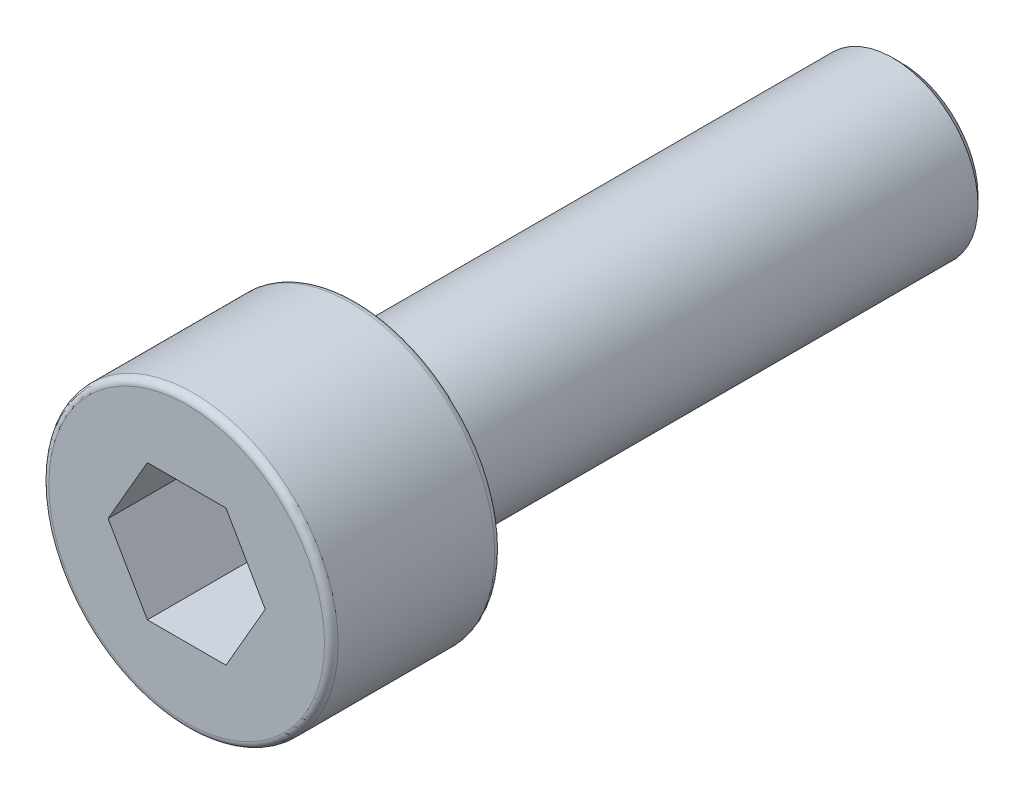
ISO-10303-21;
HEADER;
FILE_DESCRIPTION(('STEP AP214'),'2;1');
FILE_NAME('part.step','',(''),(''),'','','');
FILE_SCHEMA(('AUTOMOTIVE_DESIGN { 1 0 10303 214 1 1 1 1 }'));
ENDSEC;
DATA;
#1=APPLICATION_CONTEXT('core data for automotive mechanical design processes');
#2=APPLICATION_PROTOCOL_DEFINITION('international standard','automotive_design',2000,#1);
#3=PRODUCT_CONTEXT('',#1,'mechanical');
#4=PRODUCT('Part','Part','',(#3));
#5=PRODUCT_RELATED_PRODUCT_CATEGORY('part','',(#4));
#6=PRODUCT_DEFINITION_FORMATION('','',#4);
#7=PRODUCT_DEFINITION_CONTEXT('part definition',#1,'design');
#8=PRODUCT_DEFINITION('design','',#6,#7);
#9=PRODUCT_DEFINITION_SHAPE('','',#8);
#10=(LENGTH_UNIT() NAMED_UNIT(*) SI_UNIT(.MILLI.,.METRE.));
#11=(NAMED_UNIT(*) PLANE_ANGLE_UNIT() SI_UNIT($,.RADIAN.));
#12=(NAMED_UNIT(*) SI_UNIT($,.STERADIAN.) SOLID_ANGLE_UNIT());
#13=UNCERTAINTY_MEASURE_WITH_UNIT(LENGTH_MEASURE(1.E-05),#10,'distance_accuracy_value','');
#14=(GEOMETRIC_REPRESENTATION_CONTEXT(3) GLOBAL_UNCERTAINTY_ASSIGNED_CONTEXT((#13)) GLOBAL_UNIT_ASSIGNED_CONTEXT((#10,
#11,#12)) REPRESENTATION_CONTEXT('',''));
#15=CARTESIAN_POINT('',(0.,0.,0.));
#16=DIRECTION('',(0.,0.,1.));
#17=DIRECTION('',(1.,0.,0.));
#18=AXIS2_PLACEMENT_3D('',#15,#16,#17);
#19=CARTESIAN_POINT('',(0.,0.,17.));
#20=DIRECTION('',(0.,0.,1.));
#21=DIRECTION('',(0.,-1.,0.));
#22=AXIS2_PLACEMENT_3D('',#19,#20,#21);
#23=PLANE('',#22);
#24=DIRECTION('',(1.,0.,0.));
#25=VECTOR('',#24,1.);
#26=CARTESIAN_POINT('',(0.,-2.,17.));
#27=LINE('',#26,#25);
#28=CARTESIAN_POINT('',(-1.15470053837925,-2.,17.));
#29=VERTEX_POINT('',#28);
#30=CARTESIAN_POINT('',(1.15470053837925,-2.,17.));
#31=VERTEX_POINT('',#30);
#32=EDGE_CURVE('E82',#29,#31,#27,.T.);
#33=ORIENTED_EDGE('',*,*,#32,.T.);
#34=DIRECTION('',(0.5,0.866025403784439,0.));
#35=VECTOR('',#34,1.);
#36=CARTESIAN_POINT('',(1.73205080756888,-1.,17.));
#37=LINE('',#36,#35);
#38=CARTESIAN_POINT('',(2.3094010767585,0.,17.));
#39=VERTEX_POINT('',#38);
#40=EDGE_CURVE('E66',#31,#39,#37,.T.);
#41=ORIENTED_EDGE('',*,*,#40,.T.);
#42=DIRECTION('',(-0.499999999999999,0.866025403784439,0.));
#43=VECTOR('',#42,1.);
#44=CARTESIAN_POINT('',(1.73205080756888,1.,17.));
#45=LINE('',#44,#43);
#46=CARTESIAN_POINT('',(1.15470053837925,2.,17.));
#47=VERTEX_POINT('',#46);
#48=EDGE_CURVE('E71',#39,#47,#45,.T.);
#49=ORIENTED_EDGE('',*,*,#48,.T.);
#50=DIRECTION('',(1.,0.,0.));
#51=VECTOR('',#50,1.);
#52=CARTESIAN_POINT('',(0.,2.,17.));
#53=LINE('',#52,#51);
#54=CARTESIAN_POINT('',(-1.15470053837925,2.,17.));
#55=VERTEX_POINT('',#54);
#56=EDGE_CURVE('E178',#47,#55,#53,.F.);
#57=ORIENTED_EDGE('',*,*,#56,.T.);
#58=DIRECTION('',(-0.5,-0.866025403784439,0.));
#59=VECTOR('',#58,1.);
#60=CARTESIAN_POINT('',(-1.73205080756888,1.,17.));
#61=LINE('',#60,#59);
#62=CARTESIAN_POINT('',(-2.3094010767585,0.,17.));
#63=VERTEX_POINT('',#62);
#64=EDGE_CURVE('E191',#55,#63,#61,.T.);
#65=ORIENTED_EDGE('',*,*,#64,.T.);
#66=DIRECTION('',(0.499999999999999,-0.866025403784439,0.));
#67=VECTOR('',#66,1.);
#68=CARTESIAN_POINT('',(-1.73205080756887,-0.999999999999999,17.));
#69=LINE('',#68,#67);
#70=EDGE_CURVE('E196',#63,#29,#69,.T.);
#71=ORIENTED_EDGE('',*,*,#70,.T.);
#72=EDGE_LOOP('',(#33,#41,#49,#57,#65,#71));
#73=FACE_BOUND('',#72,.T.);
#74=ADVANCED_FACE('F16',(#73),#23,.T.);
#75=CARTESIAN_POINT('',(1.73205080756888,1.,21.));
#76=DIRECTION('',(0.866025403784439,0.499999999999999,0.));
#77=DIRECTION('',(-0.499999999999999,0.866025403784439,0.));
#78=AXIS2_PLACEMENT_3D('',#75,#76,#77);
#79=PLANE('',#78);
#80=DIRECTION('',(0.,0.,1.));
#81=VECTOR('',#80,1.);
#82=CARTESIAN_POINT('',(2.3094010767585,0.,21.));
#83=LINE('',#82,#81);
#84=CARTESIAN_POINT('',(2.3094010767585,0.,21.));
#85=VERTEX_POINT('',#84);
#86=EDGE_CURVE('E73',#39,#85,#83,.T.);
#87=ORIENTED_EDGE('',*,*,#86,.T.);
#88=DIRECTION('',(0.499999999999999,-0.866025403784439,0.));
#89=VECTOR('',#88,1.);
#90=CARTESIAN_POINT('',(1.15470053837925,2.,21.));
#91=LINE('',#90,#89);
#92=CARTESIAN_POINT('',(1.15470053837925,2.,21.));
#93=VERTEX_POINT('',#92);
#94=EDGE_CURVE('E176',#93,#85,#91,.T.);
#95=ORIENTED_EDGE('',*,*,#94,.F.);
#96=DIRECTION('',(0.,0.,1.));
#97=VECTOR('',#96,1.);
#98=CARTESIAN_POINT('',(1.15470053837925,2.,21.));
#99=LINE('',#98,#97);
#100=EDGE_CURVE('E76',#93,#47,#99,.F.);
#101=ORIENTED_EDGE('',*,*,#100,.T.);
#102=ORIENTED_EDGE('',*,*,#48,.F.);
#103=EDGE_LOOP('',(#87,#95,#101,#102));
#104=FACE_BOUND('',#103,.T.);
#105=ADVANCED_FACE('F72',(#104),#79,.F.);
#106=CARTESIAN_POINT('',(1.73205080756888,-1.,21.));
#107=DIRECTION('',(0.866025403784439,-0.5,0.));
#108=DIRECTION('',(0.5,0.866025403784439,0.));
#109=AXIS2_PLACEMENT_3D('',#106,#107,#108);
#110=PLANE('',#109);
#111=DIRECTION('',(0.,0.,-1.));
#112=VECTOR('',#111,1.);
#113=CARTESIAN_POINT('',(1.15470053837925,-2.,21.));
#114=LINE('',#113,#112);
#115=CARTESIAN_POINT('',(1.15470053837925,-2.,21.));
#116=VERTEX_POINT('',#115);
#117=EDGE_CURVE('E84',#31,#116,#114,.F.);
#118=ORIENTED_EDGE('',*,*,#117,.T.);
#119=DIRECTION('',(-0.5,-0.866025403784439,0.));
#120=VECTOR('',#119,1.);
#121=CARTESIAN_POINT('',(2.3094010767585,0.,21.));
#122=LINE('',#121,#120);
#123=EDGE_CURVE('E88',#85,#116,#122,.T.);
#124=ORIENTED_EDGE('',*,*,#123,.F.);
#125=ORIENTED_EDGE('',*,*,#86,.F.);
#126=ORIENTED_EDGE('',*,*,#40,.F.);
#127=EDGE_LOOP('',(#118,#124,#125,#126));
#128=FACE_BOUND('',#127,.T.);
#129=ADVANCED_FACE('F86',(#128),#110,.F.);
#130=CARTESIAN_POINT('',(0.,-2.,21.));
#131=DIRECTION('',(0.,-1.,0.));
#132=DIRECTION('',(0.,0.,-1.));
#133=AXIS2_PLACEMENT_3D('',#130,#131,#132);
#134=PLANE('',#133);
#135=DIRECTION('',(0.,0.,1.));
#136=VECTOR('',#135,1.);
#137=CARTESIAN_POINT('',(-1.15470053837925,-2.,21.));
#138=LINE('',#137,#136);
#139=CARTESIAN_POINT('',(-1.15470053837925,-2.,21.));
#140=VERTEX_POINT('',#139);
#141=EDGE_CURVE('E198',#29,#140,#138,.T.);
#142=ORIENTED_EDGE('',*,*,#141,.T.);
#143=DIRECTION('',(1.,0.,0.));
#144=VECTOR('',#143,1.);
#145=CARTESIAN_POINT('',(0.,-2.,21.));
#146=LINE('',#145,#144);
#147=EDGE_CURVE('E172',#116,#140,#146,.F.);
#148=ORIENTED_EDGE('',*,*,#147,.F.);
#149=ORIENTED_EDGE('',*,*,#117,.F.);
#150=ORIENTED_EDGE('',*,*,#32,.F.);
#151=EDGE_LOOP('',(#142,#148,#149,#150));
#152=FACE_BOUND('',#151,.T.);
#153=ADVANCED_FACE('F202',(#152),#134,.F.);
#154=CARTESIAN_POINT('',(-1.73205080756887,-0.999999999999999,21.));
#155=DIRECTION('',(-0.866025403784439,-0.499999999999999,0.));
#156=DIRECTION('',(0.499999999999999,-0.866025403784439,0.));
#157=AXIS2_PLACEMENT_3D('',#154,#155,#156);
#158=PLANE('',#157);
#159=DIRECTION('',(0.,0.,1.));
#160=VECTOR('',#159,1.);
#161=CARTESIAN_POINT('',(-2.3094010767585,0.,21.));
#162=LINE('',#161,#160);
#163=CARTESIAN_POINT('',(-2.3094010767585,0.,21.));
#164=VERTEX_POINT('',#163);
#165=EDGE_CURVE('E194',#63,#164,#162,.T.);
#166=ORIENTED_EDGE('',*,*,#165,.T.);
#167=DIRECTION('',(-0.499999999999999,0.866025403784439,0.));
#168=VECTOR('',#167,1.);
#169=CARTESIAN_POINT('',(-1.15470053837925,-2.,21.));
#170=LINE('',#169,#168);
#171=EDGE_CURVE('E169',#140,#164,#170,.T.);
#172=ORIENTED_EDGE('',*,*,#171,.F.);
#173=ORIENTED_EDGE('',*,*,#141,.F.);
#174=ORIENTED_EDGE('',*,*,#70,.F.);
#175=EDGE_LOOP('',(#166,#172,#173,#174));
#176=FACE_BOUND('',#175,.T.);
#177=ADVANCED_FACE('F211',(#176),#158,.F.);
#178=CARTESIAN_POINT('',(-1.73205080756888,1.,21.));
#179=DIRECTION('',(-0.866025403784439,0.5,0.));
#180=DIRECTION('',(-0.5,-0.866025403784439,0.));
#181=AXIS2_PLACEMENT_3D('',#178,#179,#180);
#182=PLANE('',#181);
#183=DIRECTION('',(0.,0.,1.));
#184=VECTOR('',#183,1.);
#185=CARTESIAN_POINT('',(-1.15470053837925,2.,21.));
#186=LINE('',#185,#184);
#187=CARTESIAN_POINT('',(-1.15470053837925,2.,21.));
#188=VERTEX_POINT('',#187);
#189=EDGE_CURVE('E34',#55,#188,#186,.T.);
#190=ORIENTED_EDGE('',*,*,#189,.T.);
#191=DIRECTION('',(0.5,0.866025403784439,0.));
#192=VECTOR('',#191,1.);
#193=CARTESIAN_POINT('',(-2.3094010767585,0.,21.));
#194=LINE('',#193,#192);
#195=EDGE_CURVE('E166',#164,#188,#194,.T.);
#196=ORIENTED_EDGE('',*,*,#195,.F.);
#197=ORIENTED_EDGE('',*,*,#165,.F.);
#198=ORIENTED_EDGE('',*,*,#64,.F.);
#199=EDGE_LOOP('',(#190,#196,#197,#198));
#200=FACE_BOUND('',#199,.T.);
#201=ADVANCED_FACE('F209',(#200),#182,.F.);
#202=CARTESIAN_POINT('',(0.,2.,21.));
#203=DIRECTION('',(0.,1.,0.));
#204=DIRECTION('',(0.,0.,1.));
#205=AXIS2_PLACEMENT_3D('',#202,#203,#204);
#206=PLANE('',#205);
#207=ORIENTED_EDGE('',*,*,#100,.F.);
#208=DIRECTION('',(1.,0.,0.));
#209=VECTOR('',#208,1.);
#210=CARTESIAN_POINT('',(0.,2.,21.));
#211=LINE('',#210,#209);
#212=EDGE_CURVE('E158',#188,#93,#211,.T.);
#213=ORIENTED_EDGE('',*,*,#212,.F.);
#214=ORIENTED_EDGE('',*,*,#189,.F.);
#215=ORIENTED_EDGE('',*,*,#56,.F.);
#216=EDGE_LOOP('',(#207,#213,#214,#215));
#217=FACE_BOUND('',#216,.T.);
#218=ADVANCED_FACE('F207',(#217),#206,.F.);
#219=CARTESIAN_POINT('',(0.,0.,21.));
#220=DIRECTION('',(0.,0.,1.));
#221=DIRECTION('',(1.,0.,0.));
#222=AXIS2_PLACEMENT_3D('',#219,#220,#221);
#223=PLANE('',#222);
#224=CARTESIAN_POINT('',(0.,0.,21.));
#225=DIRECTION('',(0.,0.,-1.));
#226=DIRECTION('',(1.,0.,0.));
#227=AXIS2_PLACEMENT_3D('',#224,#225,#226);
#228=CIRCLE('',#227,4.05);
#229=CARTESIAN_POINT('',(4.05,0.,21.));
#230=VERTEX_POINT('',#229);
#231=EDGE_CURVE('E110',#230,#230,#228,.T.);
#232=ORIENTED_EDGE('',*,*,#231,.F.);
#233=EDGE_LOOP('',(#232));
#234=FACE_BOUND('',#233,.T.);
#235=ORIENTED_EDGE('',*,*,#195,.T.);
#236=ORIENTED_EDGE('',*,*,#212,.T.);
#237=ORIENTED_EDGE('',*,*,#94,.T.);
#238=ORIENTED_EDGE('',*,*,#123,.T.);
#239=ORIENTED_EDGE('',*,*,#147,.T.);
#240=ORIENTED_EDGE('',*,*,#171,.T.);
#241=EDGE_LOOP('',(#235,#236,#237,#238,#239,#240));
#242=FACE_BOUND('',#241,.T.);
#243=ADVANCED_FACE('F143',(#234,#242),#223,.T.);
#244=CARTESIAN_POINT('',(0.,0.,20.8));
#245=DIRECTION('',(0.,0.,-1.));
#246=DIRECTION('',(1.,0.,0.));
#247=AXIS2_PLACEMENT_3D('',#244,#245,#246);
#248=TOROIDAL_SURFACE('',#247,4.05,0.2);
#249=CARTESIAN_POINT('',(0.,0.,20.8));
#250=DIRECTION('',(0.,0.,1.));
#251=DIRECTION('',(1.,0.,0.));
#252=AXIS2_PLACEMENT_3D('',#249,#250,#251);
#253=CIRCLE('',#252,4.25);
#254=CARTESIAN_POINT('',(4.25,0.,20.8));
#255=VERTEX_POINT('',#254);
#256=EDGE_CURVE('E105',#255,#255,#253,.F.);
#257=ORIENTED_EDGE('',*,*,#256,.F.);
#258=EDGE_LOOP('',(#257));
#259=FACE_BOUND('',#258,.T.);
#260=ORIENTED_EDGE('',*,*,#231,.T.);
#261=EDGE_LOOP('',(#260));
#262=FACE_BOUND('',#261,.T.);
#263=ADVANCED_FACE('F137',(#259,#262),#248,.T.);
#264=CARTESIAN_POINT('',(0.,0.,16.));
#265=DIRECTION('',(0.,0.,1.));
#266=DIRECTION('',(1.,0.,0.));
#267=AXIS2_PLACEMENT_3D('',#264,#265,#266);
#268=CYLINDRICAL_SURFACE('',#267,4.25);
#269=CARTESIAN_POINT('',(0.,0.,16.2));
#270=DIRECTION('',(0.,0.,1.));
#271=DIRECTION('',(1.,0.,0.));
#272=AXIS2_PLACEMENT_3D('',#269,#270,#271);
#273=CIRCLE('',#272,4.25);
#274=CARTESIAN_POINT('',(4.25,0.,16.2));
#275=VERTEX_POINT('',#274);
#276=EDGE_CURVE('E100',#275,#275,#273,.F.);
#277=ORIENTED_EDGE('',*,*,#276,.F.);
#278=EDGE_LOOP('',(#277));
#279=FACE_BOUND('',#278,.T.);
#280=ORIENTED_EDGE('',*,*,#256,.T.);
#281=EDGE_LOOP('',(#280));
#282=FACE_BOUND('',#281,.T.);
#283=ADVANCED_FACE('F133',(#279,#282),#268,.T.);
#284=CARTESIAN_POINT('',(0.,0.,16.2));
#285=DIRECTION('',(0.,0.,1.));
#286=DIRECTION('',(1.,0.,0.));
#287=AXIS2_PLACEMENT_3D('',#284,#285,#286);
#288=TOROIDAL_SURFACE('',#287,4.05,0.2);
#289=ORIENTED_EDGE('',*,*,#276,.T.);
#290=EDGE_LOOP('',(#289));
#291=FACE_BOUND('',#290,.T.);
#292=CARTESIAN_POINT('',(0.,0.,16.));
#293=DIRECTION('',(0.,0.,1.));
#294=DIRECTION('',(1.,0.,0.));
#295=AXIS2_PLACEMENT_3D('',#292,#293,#294);
#296=CIRCLE('',#295,4.05);
#297=CARTESIAN_POINT('',(4.05,0.,16.));
#298=VERTEX_POINT('',#297);
#299=EDGE_CURVE('E96',#298,#298,#296,.T.);
#300=ORIENTED_EDGE('',*,*,#299,.T.);
#301=EDGE_LOOP('',(#300));
#302=FACE_BOUND('',#301,.T.);
#303=ADVANCED_FACE('F122',(#291,#302),#288,.T.);
#304=CARTESIAN_POINT('',(0.,0.,0.));
#305=DIRECTION('',(0.,0.,1.));
#306=DIRECTION('',(1.,0.,0.));
#307=AXIS2_PLACEMENT_3D('',#304,#305,#306);
#308=PLANE('',#307);
#309=CARTESIAN_POINT('',(0.,0.,-5.6843418860808E-11));
#310=DIRECTION('',(0.,0.,1.));
#311=DIRECTION('',(1.,0.,0.));
#312=AXIS2_PLACEMENT_3D('',#309,#310,#311);
#313=CIRCLE('',#312,2.24999999994679);
#314=CARTESIAN_POINT('',(2.24999999994679,0.,-5.6843418860808E-11));
#315=VERTEX_POINT('',#314);
#316=EDGE_CURVE('E19',#315,#315,#313,.T.);
#317=ORIENTED_EDGE('',*,*,#316,.F.);
#318=EDGE_LOOP('',(#317));
#319=FACE_BOUND('',#318,.T.);
#320=ADVANCED_FACE('F132',(#319),#308,.F.);
#321=CARTESIAN_POINT('',(0.,0.,16.));
#322=DIRECTION('',(0.,0.,1.));
#323=DIRECTION('',(1.,0.,0.));
#324=AXIS2_PLACEMENT_3D('',#321,#322,#323);
#325=PLANE('',#324);
#326=ORIENTED_EDGE('',*,*,#299,.F.);
#327=EDGE_LOOP('',(#326));
#328=FACE_BOUND('',#327,.T.);
#329=CARTESIAN_POINT('',(0.,0.,16.));
#330=DIRECTION('',(0.,0.,1.));
#331=DIRECTION('',(1.,0.,0.));
#332=AXIS2_PLACEMENT_3D('',#329,#330,#331);
#333=CIRCLE('',#332,2.5);
#334=CARTESIAN_POINT('',(2.5,0.,16.));
#335=VERTEX_POINT('',#334);
#336=EDGE_CURVE('E25',#335,#335,#333,.F.);
#337=ORIENTED_EDGE('',*,*,#336,.F.);
#338=EDGE_LOOP('',(#337));
#339=FACE_BOUND('',#338,.T.);
#340=ADVANCED_FACE('F229',(#328,#339),#325,.F.);
#341=CARTESIAN_POINT('',(0.,0.,0.250000000050932));
#342=DIRECTION('',(0.,0.,1.));
#343=DIRECTION('',(1.,0.,0.));
#344=AXIS2_PLACEMENT_3D('',#341,#342,#343);
#345=CONICAL_SURFACE('',#344,2.50000000005457,0.785398163397448);
#346=CARTESIAN_POINT('',(0.,0.,0.25));
#347=DIRECTION('',(0.,0.,1.));
#348=DIRECTION('',(1.,0.,0.));
#349=AXIS2_PLACEMENT_3D('',#346,#347,#348);
#350=CIRCLE('',#349,2.5);
#351=CARTESIAN_POINT('',(2.5,0.,0.25));
#352=VERTEX_POINT('',#351);
#353=EDGE_CURVE('E11',#352,#352,#350,.T.);
#354=ORIENTED_EDGE('',*,*,#353,.F.);
#355=EDGE_LOOP('',(#354));
#356=FACE_BOUND('',#355,.T.);
#357=ORIENTED_EDGE('',*,*,#316,.T.);
#358=EDGE_LOOP('',(#357));
#359=FACE_BOUND('',#358,.T.);
#360=ADVANCED_FACE('F223',(#356,#359),#345,.T.);
#361=CARTESIAN_POINT('',(0.,0.,0.));
#362=DIRECTION('',(0.,0.,1.));
#363=DIRECTION('',(1.,0.,0.));
#364=AXIS2_PLACEMENT_3D('',#361,#362,#363);
#365=CYLINDRICAL_SURFACE('',#364,2.5);
#366=ORIENTED_EDGE('',*,*,#353,.T.);
#367=EDGE_LOOP('',(#366));
#368=FACE_BOUND('',#367,.T.);
#369=ORIENTED_EDGE('',*,*,#336,.T.);
#370=EDGE_LOOP('',(#369));
#371=FACE_BOUND('',#370,.T.);
#372=ADVANCED_FACE('F221',(#368,#371),#365,.T.);
#373=CLOSED_SHELL('',(#74,#105,#129,#153,#177,#201,#218,#243,#263,#283,#303,#320,#340,#360,#372));
#374=MANIFOLD_SOLID_BREP('B1',#373);
#375=ADVANCED_BREP_SHAPE_REPRESENTATION('',(#18,#374),#14);
#376=SHAPE_DEFINITION_REPRESENTATION(#9,#375);
ENDSEC;
END-ISO-10303-21;
